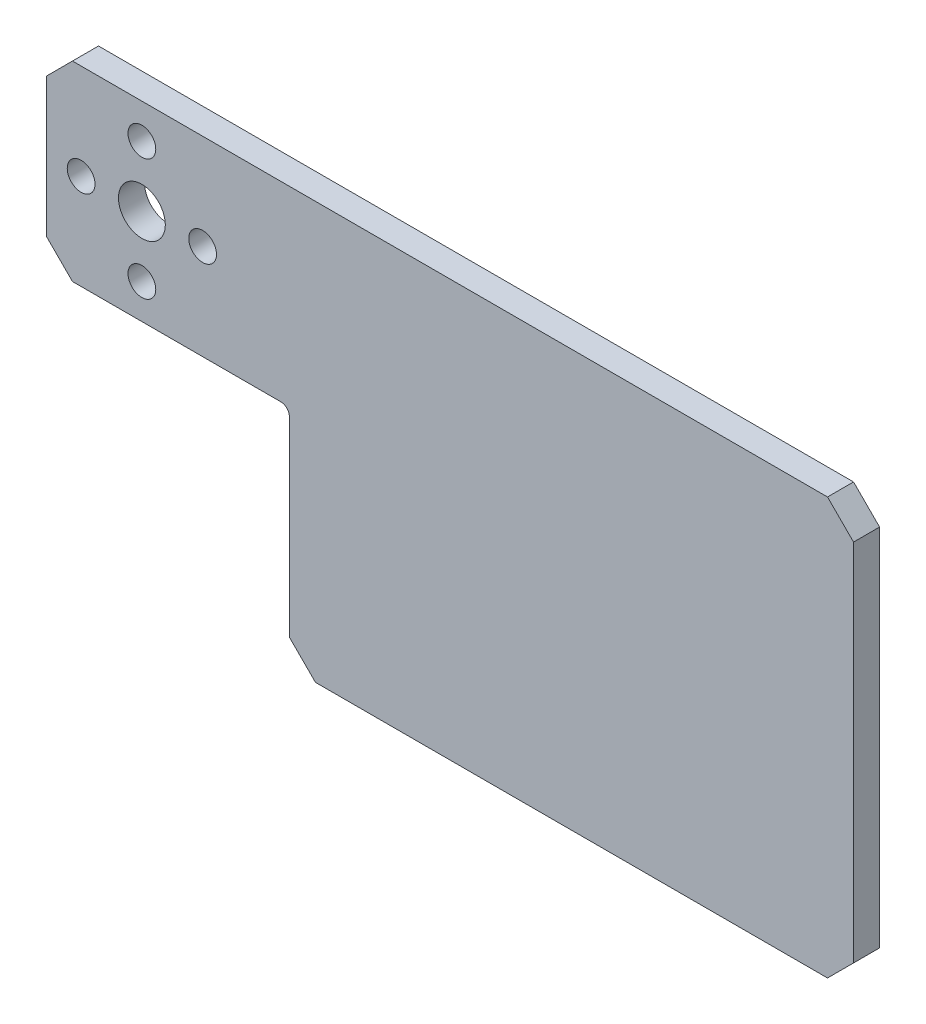
ISO-10303-21;
HEADER;
FILE_DESCRIPTION(('STEP AP214'),'2;1');
FILE_NAME('part.step','',(''),(''),'','','');
FILE_SCHEMA(('AUTOMOTIVE_DESIGN { 1 0 10303 214 1 1 1 1 }'));
ENDSEC;
DATA;
#1=APPLICATION_CONTEXT('core data for automotive mechanical design processes');
#2=APPLICATION_PROTOCOL_DEFINITION('international standard','automotive_design',2000,#1);
#3=PRODUCT_CONTEXT('',#1,'mechanical');
#4=PRODUCT('Part','Part','',(#3));
#5=PRODUCT_RELATED_PRODUCT_CATEGORY('part','',(#4));
#6=PRODUCT_DEFINITION_FORMATION('','',#4);
#7=PRODUCT_DEFINITION_CONTEXT('part definition',#1,'design');
#8=PRODUCT_DEFINITION('design','',#6,#7);
#9=PRODUCT_DEFINITION_SHAPE('','',#8);
#10=(LENGTH_UNIT() NAMED_UNIT(*) SI_UNIT(.MILLI.,.METRE.));
#11=(NAMED_UNIT(*) PLANE_ANGLE_UNIT() SI_UNIT($,.RADIAN.));
#12=(NAMED_UNIT(*) SI_UNIT($,.STERADIAN.) SOLID_ANGLE_UNIT());
#13=UNCERTAINTY_MEASURE_WITH_UNIT(LENGTH_MEASURE(1.E-05),#10,'distance_accuracy_value','');
#14=(GEOMETRIC_REPRESENTATION_CONTEXT(3) GLOBAL_UNCERTAINTY_ASSIGNED_CONTEXT((#13)) GLOBAL_UNIT_ASSIGNED_CONTEXT((#10,
#11,#12)) REPRESENTATION_CONTEXT('',''));
#15=CARTESIAN_POINT('',(0.,0.,0.));
#16=DIRECTION('',(0.,0.,1.));
#17=DIRECTION('',(1.,0.,0.));
#18=AXIS2_PLACEMENT_3D('',#15,#16,#17);
#19=CARTESIAN_POINT('',(-46.5,-24.,3.));
#20=DIRECTION('',(1.,0.,0.));
#21=DIRECTION('',(0.,0.,-1.));
#22=AXIS2_PLACEMENT_3D('',#19,#20,#21);
#23=PLANE('',#22);
#24=DIRECTION('',(0.,-1.,0.));
#25=VECTOR('',#24,1.);
#26=CARTESIAN_POINT('',(-46.5,-24.,3.));
#27=LINE('',#26,#25);
#28=CARTESIAN_POINT('',(-46.5,21.,3.));
#29=VERTEX_POINT('',#28);
#30=CARTESIAN_POINT('',(-46.5,5.,3.));
#31=VERTEX_POINT('',#30);
#32=EDGE_CURVE('E193',#29,#31,#27,.T.);
#33=ORIENTED_EDGE('',*,*,#32,.F.);
#34=DIRECTION('',(0.,0.,-1.));
#35=VECTOR('',#34,1.);
#36=CARTESIAN_POINT('',(-46.5,21.,3.));
#37=LINE('',#36,#35);
#38=CARTESIAN_POINT('',(-46.5,21.,0.));
#39=VERTEX_POINT('',#38);
#40=EDGE_CURVE('E46',#29,#39,#37,.T.);
#41=ORIENTED_EDGE('',*,*,#40,.T.);
#42=DIRECTION('',(0.,-1.,0.));
#43=VECTOR('',#42,1.);
#44=CARTESIAN_POINT('',(-46.5,-24.,0.));
#45=LINE('',#44,#43);
#46=CARTESIAN_POINT('',(-46.5,5.,0.));
#47=VERTEX_POINT('',#46);
#48=EDGE_CURVE('E184',#39,#47,#45,.T.);
#49=ORIENTED_EDGE('',*,*,#48,.T.);
#50=DIRECTION('',(0.,0.,1.));
#51=VECTOR('',#50,1.);
#52=CARTESIAN_POINT('',(-46.5,5.,3.));
#53=LINE('',#52,#51);
#54=EDGE_CURVE('E248',#47,#31,#53,.T.);
#55=ORIENTED_EDGE('',*,*,#54,.T.);
#56=EDGE_LOOP('',(#33,#41,#49,#55));
#57=FACE_BOUND('',#56,.T.);
#58=ADVANCED_FACE('F37',(#57),#23,.F.);
#59=CARTESIAN_POINT('',(46.5,-24.,3.));
#60=DIRECTION('',(0.,1.,0.));
#61=DIRECTION('',(-1.,0.,0.));
#62=AXIS2_PLACEMENT_3D('',#59,#60,#61);
#63=PLANE('',#62);
#64=DIRECTION('',(1.,0.,0.));
#65=VECTOR('',#64,1.);
#66=CARTESIAN_POINT('',(46.5,-24.,3.));
#67=LINE('',#66,#65);
#68=CARTESIAN_POINT('',(-15.5,-24.,3.));
#69=VERTEX_POINT('',#68);
#70=CARTESIAN_POINT('',(43.5,-24.,3.));
#71=VERTEX_POINT('',#70);
#72=EDGE_CURVE('E195',#69,#71,#67,.T.);
#73=ORIENTED_EDGE('',*,*,#72,.F.);
#74=DIRECTION('',(0.,0.,-1.));
#75=VECTOR('',#74,1.);
#76=CARTESIAN_POINT('',(-15.5,-24.,3.));
#77=LINE('',#76,#75);
#78=CARTESIAN_POINT('',(-15.5,-24.,0.));
#79=VERTEX_POINT('',#78);
#80=EDGE_CURVE('E229',#69,#79,#77,.T.);
#81=ORIENTED_EDGE('',*,*,#80,.T.);
#82=DIRECTION('',(1.,0.,0.));
#83=VECTOR('',#82,1.);
#84=CARTESIAN_POINT('',(46.5,-24.,0.));
#85=LINE('',#84,#83);
#86=CARTESIAN_POINT('',(43.5,-24.,0.));
#87=VERTEX_POINT('',#86);
#88=EDGE_CURVE('E206',#79,#87,#85,.T.);
#89=ORIENTED_EDGE('',*,*,#88,.T.);
#90=DIRECTION('',(0.,0.,1.));
#91=VECTOR('',#90,1.);
#92=CARTESIAN_POINT('',(43.5,-24.,3.));
#93=LINE('',#92,#91);
#94=EDGE_CURVE('E227',#87,#71,#93,.T.);
#95=ORIENTED_EDGE('',*,*,#94,.T.);
#96=EDGE_LOOP('',(#73,#81,#89,#95));
#97=FACE_BOUND('',#96,.T.);
#98=ADVANCED_FACE('F280',(#97),#63,.F.);
#99=CARTESIAN_POINT('',(46.5,-24.,3.));
#100=DIRECTION('',(-1.,0.,0.));
#101=DIRECTION('',(0.,0.,1.));
#102=AXIS2_PLACEMENT_3D('',#99,#100,#101);
#103=PLANE('',#102);
#104=DIRECTION('',(0.,1.,0.));
#105=VECTOR('',#104,1.);
#106=CARTESIAN_POINT('',(46.5,-24.,3.));
#107=LINE('',#106,#105);
#108=CARTESIAN_POINT('',(46.5,-21.,3.));
#109=VERTEX_POINT('',#108);
#110=CARTESIAN_POINT('',(46.5,21.,3.));
#111=VERTEX_POINT('',#110);
#112=EDGE_CURVE('E199',#109,#111,#107,.T.);
#113=ORIENTED_EDGE('',*,*,#112,.F.);
#114=DIRECTION('',(0.,0.,-1.));
#115=VECTOR('',#114,1.);
#116=CARTESIAN_POINT('',(46.5,-21.,3.));
#117=LINE('',#116,#115);
#118=CARTESIAN_POINT('',(46.5,-21.,0.));
#119=VERTEX_POINT('',#118);
#120=EDGE_CURVE('E241',#109,#119,#117,.T.);
#121=ORIENTED_EDGE('',*,*,#120,.T.);
#122=DIRECTION('',(0.,1.,0.));
#123=VECTOR('',#122,1.);
#124=CARTESIAN_POINT('',(46.5,-24.,0.));
#125=LINE('',#124,#123);
#126=CARTESIAN_POINT('',(46.5,21.,0.));
#127=VERTEX_POINT('',#126);
#128=EDGE_CURVE('E209',#119,#127,#125,.T.);
#129=ORIENTED_EDGE('',*,*,#128,.T.);
#130=DIRECTION('',(0.,0.,1.));
#131=VECTOR('',#130,1.);
#132=CARTESIAN_POINT('',(46.5,21.,3.));
#133=LINE('',#132,#131);
#134=EDGE_CURVE('E239',#127,#111,#133,.T.);
#135=ORIENTED_EDGE('',*,*,#134,.T.);
#136=EDGE_LOOP('',(#113,#121,#129,#135));
#137=FACE_BOUND('',#136,.T.);
#138=ADVANCED_FACE('F274',(#137),#103,.F.);
#139=CARTESIAN_POINT('',(46.5,24.,3.));
#140=DIRECTION('',(0.,-1.,0.));
#141=DIRECTION('',(1.,0.,0.));
#142=AXIS2_PLACEMENT_3D('',#139,#140,#141);
#143=PLANE('',#142);
#144=DIRECTION('',(-1.,0.,0.));
#145=VECTOR('',#144,1.);
#146=CARTESIAN_POINT('',(46.5,24.,3.));
#147=LINE('',#146,#145);
#148=CARTESIAN_POINT('',(43.5,24.,3.));
#149=VERTEX_POINT('',#148);
#150=CARTESIAN_POINT('',(-43.5,24.,3.));
#151=VERTEX_POINT('',#150);
#152=EDGE_CURVE('E149',#149,#151,#147,.T.);
#153=ORIENTED_EDGE('',*,*,#152,.F.);
#154=DIRECTION('',(0.,0.,-1.));
#155=VECTOR('',#154,1.);
#156=CARTESIAN_POINT('',(43.5,24.,3.));
#157=LINE('',#156,#155);
#158=CARTESIAN_POINT('',(43.5,24.,0.));
#159=VERTEX_POINT('',#158);
#160=EDGE_CURVE('E245',#149,#159,#157,.T.);
#161=ORIENTED_EDGE('',*,*,#160,.T.);
#162=DIRECTION('',(-1.,0.,0.));
#163=VECTOR('',#162,1.);
#164=CARTESIAN_POINT('',(46.5,24.,0.));
#165=LINE('',#164,#163);
#166=CARTESIAN_POINT('',(-43.5,24.,0.));
#167=VERTEX_POINT('',#166);
#168=EDGE_CURVE('E196',#159,#167,#165,.T.);
#169=ORIENTED_EDGE('',*,*,#168,.T.);
#170=DIRECTION('',(0.,0.,1.));
#171=VECTOR('',#170,1.);
#172=CARTESIAN_POINT('',(-43.5,24.,3.));
#173=LINE('',#172,#171);
#174=EDGE_CURVE('E243',#167,#151,#173,.T.);
#175=ORIENTED_EDGE('',*,*,#174,.T.);
#176=EDGE_LOOP('',(#153,#161,#169,#175));
#177=FACE_BOUND('',#176,.T.);
#178=ADVANCED_FACE('F266',(#177),#143,.F.);
#179=CARTESIAN_POINT('',(0.,0.,3.));
#180=DIRECTION('',(0.,0.,1.));
#181=DIRECTION('',(1.,0.,0.));
#182=AXIS2_PLACEMENT_3D('',#179,#180,#181);
#183=PLANE('',#182);
#184=DIRECTION('',(0.,1.,0.));
#185=VECTOR('',#184,1.);
#186=CARTESIAN_POINT('',(-18.5,-24.,3.));
#187=LINE('',#186,#185);
#188=CARTESIAN_POINT('',(-18.5,-21.,3.));
#189=VERTEX_POINT('',#188);
#190=CARTESIAN_POINT('',(-18.5,1.,3.));
#191=VERTEX_POINT('',#190);
#192=EDGE_CURVE('E156',#189,#191,#187,.T.);
#193=ORIENTED_EDGE('',*,*,#192,.F.);
#194=DIRECTION('',(-0.707106781186549,0.707106781186546,0.));
#195=VECTOR('',#194,1.);
#196=CARTESIAN_POINT('',(-19.75,-19.7500000000001,3.));
#197=LINE('',#196,#195);
#198=EDGE_CURVE('E225',#189,#69,#197,.F.);
#199=ORIENTED_EDGE('',*,*,#198,.T.);
#200=ORIENTED_EDGE('',*,*,#72,.T.);
#201=DIRECTION('',(-0.707106781186549,-0.707106781186546,0.));
#202=VECTOR('',#201,1.);
#203=CARTESIAN_POINT('',(33.7499999999999,-33.75,3.));
#204=LINE('',#203,#202);
#205=EDGE_CURVE('E223',#71,#109,#204,.F.);
#206=ORIENTED_EDGE('',*,*,#205,.T.);
#207=ORIENTED_EDGE('',*,*,#112,.T.);
#208=DIRECTION('',(0.707106781186544,-0.707106781186551,0.));
#209=VECTOR('',#208,1.);
#210=CARTESIAN_POINT('',(33.7500000000002,33.7499999999999,3.));
#211=LINE('',#210,#209);
#212=EDGE_CURVE('E221',#111,#149,#211,.F.);
#213=ORIENTED_EDGE('',*,*,#212,.T.);
#214=ORIENTED_EDGE('',*,*,#152,.T.);
#215=DIRECTION('',(0.70710678118655,0.707106781186545,0.));
#216=VECTOR('',#215,1.);
#217=CARTESIAN_POINT('',(-33.7499999999999,33.7500000000001,3.));
#218=LINE('',#217,#216);
#219=EDGE_CURVE('E219',#151,#29,#218,.F.);
#220=ORIENTED_EDGE('',*,*,#219,.T.);
#221=ORIENTED_EDGE('',*,*,#32,.T.);
#222=DIRECTION('',(-0.707106781186549,0.707106781186546,0.));
#223=VECTOR('',#222,1.);
#224=CARTESIAN_POINT('',(-20.7499999999999,-20.75,3.));
#225=LINE('',#224,#223);
#226=CARTESIAN_POINT('',(-43.5,2.,3.));
#227=VERTEX_POINT('',#226);
#228=EDGE_CURVE('E154',#31,#227,#225,.F.);
#229=ORIENTED_EDGE('',*,*,#228,.T.);
#230=DIRECTION('',(-1.,0.,0.));
#231=VECTOR('',#230,1.);
#232=CARTESIAN_POINT('',(-46.5,2.,3.));
#233=LINE('',#232,#231);
#234=CARTESIAN_POINT('',(-19.5,2.,3.));
#235=VERTEX_POINT('',#234);
#236=EDGE_CURVE('E145',#235,#227,#233,.T.);
#237=ORIENTED_EDGE('',*,*,#236,.F.);
#238=CARTESIAN_POINT('',(-19.5,1.,3.));
#239=DIRECTION('',(0.,0.,1.));
#240=DIRECTION('',(1.,0.,0.));
#241=AXIS2_PLACEMENT_3D('',#238,#239,#240);
#242=CIRCLE('',#241,1.);
#243=EDGE_CURVE('E129',#235,#191,#242,.F.);
#244=ORIENTED_EDGE('',*,*,#243,.T.);
#245=EDGE_LOOP('',(#193,#199,#200,#206,#207,#213,#214,#220,#221,#229,#237,#244));
#246=FACE_BOUND('',#245,.T.);
#247=CARTESIAN_POINT('',(-35.4999999999999,6.,3.));
#248=DIRECTION('',(0.,0.,1.));
#249=DIRECTION('',(0.,-1.,0.));
#250=AXIS2_PLACEMENT_3D('',#247,#248,#249);
#251=CIRCLE('',#250,1.6);
#252=CARTESIAN_POINT('',(-35.4999999999999,4.4,3.));
#253=VERTEX_POINT('',#252);
#254=EDGE_CURVE('E178',#253,#253,#251,.T.);
#255=ORIENTED_EDGE('',*,*,#254,.F.);
#256=EDGE_LOOP('',(#255));
#257=FACE_BOUND('',#256,.T.);
#258=CARTESIAN_POINT('',(-35.5,20.,3.));
#259=DIRECTION('',(0.,0.,1.));
#260=DIRECTION('',(0.,1.,0.));
#261=AXIS2_PLACEMENT_3D('',#258,#259,#260);
#262=CIRCLE('',#261,1.6);
#263=CARTESIAN_POINT('',(-35.5,21.6,3.));
#264=VERTEX_POINT('',#263);
#265=EDGE_CURVE('E165',#264,#264,#262,.T.);
#266=ORIENTED_EDGE('',*,*,#265,.F.);
#267=EDGE_LOOP('',(#266));
#268=FACE_BOUND('',#267,.T.);
#269=CARTESIAN_POINT('',(-42.5,13.,3.));
#270=DIRECTION('',(0.,0.,1.));
#271=DIRECTION('',(-1.,0.,0.));
#272=AXIS2_PLACEMENT_3D('',#269,#270,#271);
#273=CIRCLE('',#272,1.6);
#274=CARTESIAN_POINT('',(-44.1,13.,3.));
#275=VERTEX_POINT('',#274);
#276=EDGE_CURVE('E166',#275,#275,#273,.T.);
#277=ORIENTED_EDGE('',*,*,#276,.F.);
#278=EDGE_LOOP('',(#277));
#279=FACE_BOUND('',#278,.T.);
#280=CARTESIAN_POINT('',(-35.5,13.,3.));
#281=DIRECTION('',(0.,0.,1.));
#282=DIRECTION('',(1.,0.,0.));
#283=AXIS2_PLACEMENT_3D('',#280,#281,#282);
#284=CIRCLE('',#283,2.7);
#285=CARTESIAN_POINT('',(-32.8,13.,3.));
#286=VERTEX_POINT('',#285);
#287=EDGE_CURVE('E185',#286,#286,#284,.T.);
#288=ORIENTED_EDGE('',*,*,#287,.F.);
#289=EDGE_LOOP('',(#288));
#290=FACE_BOUND('',#289,.T.);
#291=CARTESIAN_POINT('',(-28.5,13.,3.));
#292=DIRECTION('',(0.,0.,1.));
#293=DIRECTION('',(1.,0.,0.));
#294=AXIS2_PLACEMENT_3D('',#291,#292,#293);
#295=CIRCLE('',#294,1.6);
#296=CARTESIAN_POINT('',(-26.9,13.,3.));
#297=VERTEX_POINT('',#296);
#298=EDGE_CURVE('E173',#297,#297,#295,.T.);
#299=ORIENTED_EDGE('',*,*,#298,.F.);
#300=EDGE_LOOP('',(#299));
#301=FACE_BOUND('',#300,.T.);
#302=ADVANCED_FACE('F151',(#246,#257,#268,#279,#290,#301),#183,.T.);
#303=CARTESIAN_POINT('',(0.,0.,0.));
#304=DIRECTION('',(0.,0.,1.));
#305=DIRECTION('',(1.,0.,0.));
#306=AXIS2_PLACEMENT_3D('',#303,#304,#305);
#307=PLANE('',#306);
#308=CARTESIAN_POINT('',(-35.4999999999999,6.,0.));
#309=DIRECTION('',(0.,0.,1.));
#310=DIRECTION('',(0.,-1.,0.));
#311=AXIS2_PLACEMENT_3D('',#308,#309,#310);
#312=CIRCLE('',#311,1.6);
#313=CARTESIAN_POINT('',(-35.4999999999999,4.4,0.));
#314=VERTEX_POINT('',#313);
#315=EDGE_CURVE('E169',#314,#314,#312,.T.);
#316=ORIENTED_EDGE('',*,*,#315,.T.);
#317=EDGE_LOOP('',(#316));
#318=FACE_BOUND('',#317,.T.);
#319=CARTESIAN_POINT('',(-35.5,20.,0.));
#320=DIRECTION('',(0.,0.,1.));
#321=DIRECTION('',(0.,1.,0.));
#322=AXIS2_PLACEMENT_3D('',#319,#320,#321);
#323=CIRCLE('',#322,1.6);
#324=CARTESIAN_POINT('',(-35.5,21.6,0.));
#325=VERTEX_POINT('',#324);
#326=EDGE_CURVE('E170',#325,#325,#323,.T.);
#327=ORIENTED_EDGE('',*,*,#326,.T.);
#328=EDGE_LOOP('',(#327));
#329=FACE_BOUND('',#328,.T.);
#330=CARTESIAN_POINT('',(-42.5,13.,0.));
#331=DIRECTION('',(0.,0.,1.));
#332=DIRECTION('',(-1.,0.,0.));
#333=AXIS2_PLACEMENT_3D('',#330,#331,#332);
#334=CIRCLE('',#333,1.6);
#335=CARTESIAN_POINT('',(-44.1,13.,0.));
#336=VERTEX_POINT('',#335);
#337=EDGE_CURVE('E162',#336,#336,#334,.T.);
#338=ORIENTED_EDGE('',*,*,#337,.T.);
#339=EDGE_LOOP('',(#338));
#340=FACE_BOUND('',#339,.T.);
#341=CARTESIAN_POINT('',(-35.5,13.,0.));
#342=DIRECTION('',(0.,0.,1.));
#343=DIRECTION('',(1.,0.,0.));
#344=AXIS2_PLACEMENT_3D('',#341,#342,#343);
#345=CIRCLE('',#344,2.7);
#346=CARTESIAN_POINT('',(-32.8,13.,0.));
#347=VERTEX_POINT('',#346);
#348=EDGE_CURVE('E181',#347,#347,#345,.T.);
#349=ORIENTED_EDGE('',*,*,#348,.T.);
#350=EDGE_LOOP('',(#349));
#351=FACE_BOUND('',#350,.T.);
#352=CARTESIAN_POINT('',(-28.5,13.,0.));
#353=DIRECTION('',(0.,0.,1.));
#354=DIRECTION('',(1.,0.,0.));
#355=AXIS2_PLACEMENT_3D('',#352,#353,#354);
#356=CIRCLE('',#355,1.6);
#357=CARTESIAN_POINT('',(-26.9,13.,0.));
#358=VERTEX_POINT('',#357);
#359=EDGE_CURVE('E188',#358,#358,#356,.T.);
#360=ORIENTED_EDGE('',*,*,#359,.T.);
#361=EDGE_LOOP('',(#360));
#362=FACE_BOUND('',#361,.T.);
#363=ORIENTED_EDGE('',*,*,#88,.F.);
#364=DIRECTION('',(0.707106781186549,-0.707106781186546,0.));
#365=VECTOR('',#364,1.);
#366=CARTESIAN_POINT('',(-18.5,-21.,0.));
#367=LINE('',#366,#365);
#368=CARTESIAN_POINT('',(-18.5,-21.,0.));
#369=VERTEX_POINT('',#368);
#370=EDGE_CURVE('E237',#79,#369,#367,.F.);
#371=ORIENTED_EDGE('',*,*,#370,.T.);
#372=DIRECTION('',(0.,1.,0.));
#373=VECTOR('',#372,1.);
#374=CARTESIAN_POINT('',(-18.5,-24.,0.));
#375=LINE('',#374,#373);
#376=CARTESIAN_POINT('',(-18.5,1.,0.));
#377=VERTEX_POINT('',#376);
#378=EDGE_CURVE('E155',#369,#377,#375,.T.);
#379=ORIENTED_EDGE('',*,*,#378,.T.);
#380=CARTESIAN_POINT('',(-19.5,1.,0.));
#381=DIRECTION('',(0.,0.,1.));
#382=DIRECTION('',(1.,0.,0.));
#383=AXIS2_PLACEMENT_3D('',#380,#381,#382);
#384=CIRCLE('',#383,1.);
#385=CARTESIAN_POINT('',(-19.5,2.,0.));
#386=VERTEX_POINT('',#385);
#387=EDGE_CURVE('E139',#377,#386,#384,.T.);
#388=ORIENTED_EDGE('',*,*,#387,.T.);
#389=DIRECTION('',(-1.,0.,0.));
#390=VECTOR('',#389,1.);
#391=CARTESIAN_POINT('',(-46.5,2.,0.));
#392=LINE('',#391,#390);
#393=CARTESIAN_POINT('',(-43.5,2.,0.));
#394=VERTEX_POINT('',#393);
#395=EDGE_CURVE('E148',#386,#394,#392,.T.);
#396=ORIENTED_EDGE('',*,*,#395,.T.);
#397=DIRECTION('',(0.707106781186549,-0.707106781186546,0.));
#398=VECTOR('',#397,1.);
#399=CARTESIAN_POINT('',(-46.5,5.,0.));
#400=LINE('',#399,#398);
#401=EDGE_CURVE('E231',#394,#47,#400,.F.);
#402=ORIENTED_EDGE('',*,*,#401,.T.);
#403=ORIENTED_EDGE('',*,*,#48,.F.);
#404=DIRECTION('',(-0.70710678118655,-0.707106781186545,0.));
#405=VECTOR('',#404,1.);
#406=CARTESIAN_POINT('',(-46.5,21.,0.));
#407=LINE('',#406,#405);
#408=EDGE_CURVE('E233',#39,#167,#407,.F.);
#409=ORIENTED_EDGE('',*,*,#408,.T.);
#410=ORIENTED_EDGE('',*,*,#168,.F.);
#411=DIRECTION('',(-0.707106781186544,0.707106781186551,0.));
#412=VECTOR('',#411,1.);
#413=CARTESIAN_POINT('',(43.5,24.,0.));
#414=LINE('',#413,#412);
#415=EDGE_CURVE('E53',#159,#127,#414,.F.);
#416=ORIENTED_EDGE('',*,*,#415,.T.);
#417=ORIENTED_EDGE('',*,*,#128,.F.);
#418=DIRECTION('',(0.707106781186549,0.707106781186546,0.));
#419=VECTOR('',#418,1.);
#420=CARTESIAN_POINT('',(46.5,-21.,0.));
#421=LINE('',#420,#419);
#422=EDGE_CURVE('E61',#119,#87,#421,.F.);
#423=ORIENTED_EDGE('',*,*,#422,.T.);
#424=EDGE_LOOP('',(#363,#371,#379,#388,#396,#402,#403,#409,#410,#416,#417,#423));
#425=FACE_BOUND('',#424,.T.);
#426=ADVANCED_FACE('F259',(#318,#329,#340,#351,#362,#425),#307,.F.);
#427=CARTESIAN_POINT('',(-28.5,13.,0.));
#428=DIRECTION('',(0.,0.,1.));
#429=DIRECTION('',(1.,0.,0.));
#430=AXIS2_PLACEMENT_3D('',#427,#428,#429);
#431=CYLINDRICAL_SURFACE('',#430,1.6);
#432=ORIENTED_EDGE('',*,*,#359,.F.);
#433=EDGE_LOOP('',(#432));
#434=FACE_BOUND('',#433,.T.);
#435=ORIENTED_EDGE('',*,*,#298,.T.);
#436=EDGE_LOOP('',(#435));
#437=FACE_BOUND('',#436,.T.);
#438=ADVANCED_FACE('F373',(#434,#437),#431,.F.);
#439=CARTESIAN_POINT('',(-35.5,13.,0.));
#440=DIRECTION('',(0.,0.,1.));
#441=DIRECTION('',(1.,0.,0.));
#442=AXIS2_PLACEMENT_3D('',#439,#440,#441);
#443=CYLINDRICAL_SURFACE('',#442,2.7);
#444=ORIENTED_EDGE('',*,*,#348,.F.);
#445=EDGE_LOOP('',(#444));
#446=FACE_BOUND('',#445,.T.);
#447=ORIENTED_EDGE('',*,*,#287,.T.);
#448=EDGE_LOOP('',(#447));
#449=FACE_BOUND('',#448,.T.);
#450=ADVANCED_FACE('F441',(#446,#449),#443,.F.);
#451=CARTESIAN_POINT('',(-42.5,13.,0.));
#452=DIRECTION('',(0.,0.,1.));
#453=DIRECTION('',(1.,0.,0.));
#454=AXIS2_PLACEMENT_3D('',#451,#452,#453);
#455=CYLINDRICAL_SURFACE('',#454,1.6);
#456=ORIENTED_EDGE('',*,*,#337,.F.);
#457=EDGE_LOOP('',(#456));
#458=FACE_BOUND('',#457,.T.);
#459=ORIENTED_EDGE('',*,*,#276,.T.);
#460=EDGE_LOOP('',(#459));
#461=FACE_BOUND('',#460,.T.);
#462=ADVANCED_FACE('F431',(#458,#461),#455,.F.);
#463=CARTESIAN_POINT('',(-35.5,20.,0.));
#464=DIRECTION('',(0.,0.,1.));
#465=DIRECTION('',(1.,0.,0.));
#466=AXIS2_PLACEMENT_3D('',#463,#464,#465);
#467=CYLINDRICAL_SURFACE('',#466,1.6);
#468=ORIENTED_EDGE('',*,*,#326,.F.);
#469=EDGE_LOOP('',(#468));
#470=FACE_BOUND('',#469,.T.);
#471=ORIENTED_EDGE('',*,*,#265,.T.);
#472=EDGE_LOOP('',(#471));
#473=FACE_BOUND('',#472,.T.);
#474=ADVANCED_FACE('F421',(#470,#473),#467,.F.);
#475=CARTESIAN_POINT('',(-35.4999999999999,6.,0.));
#476=DIRECTION('',(0.,0.,1.));
#477=DIRECTION('',(1.,0.,0.));
#478=AXIS2_PLACEMENT_3D('',#475,#476,#477);
#479=CYLINDRICAL_SURFACE('',#478,1.6);
#480=ORIENTED_EDGE('',*,*,#315,.F.);
#481=EDGE_LOOP('',(#480));
#482=FACE_BOUND('',#481,.T.);
#483=ORIENTED_EDGE('',*,*,#254,.T.);
#484=EDGE_LOOP('',(#483));
#485=FACE_BOUND('',#484,.T.);
#486=ADVANCED_FACE('F295',(#482,#485),#479,.F.);
#487=CARTESIAN_POINT('',(-46.5,2.,0.));
#488=DIRECTION('',(0.,1.,0.));
#489=DIRECTION('',(0.,0.,1.));
#490=AXIS2_PLACEMENT_3D('',#487,#488,#489);
#491=PLANE('',#490);
#492=ORIENTED_EDGE('',*,*,#236,.T.);
#493=DIRECTION('',(0.,0.,-1.));
#494=VECTOR('',#493,1.);
#495=CARTESIAN_POINT('',(-43.5,2.,0.));
#496=LINE('',#495,#494);
#497=EDGE_CURVE('E11',#227,#394,#496,.T.);
#498=ORIENTED_EDGE('',*,*,#497,.T.);
#499=ORIENTED_EDGE('',*,*,#395,.F.);
#500=DIRECTION('',(0.,0.,1.));
#501=VECTOR('',#500,1.);
#502=CARTESIAN_POINT('',(-19.5,2.,3.));
#503=LINE('',#502,#501);
#504=EDGE_CURVE('E133',#386,#235,#503,.T.);
#505=ORIENTED_EDGE('',*,*,#504,.T.);
#506=EDGE_LOOP('',(#492,#498,#499,#505));
#507=FACE_BOUND('',#506,.T.);
#508=ADVANCED_FACE('F144',(#507),#491,.F.);
#509=CARTESIAN_POINT('',(-18.5,-24.,0.));
#510=DIRECTION('',(1.,0.,0.));
#511=DIRECTION('',(0.,0.,-1.));
#512=AXIS2_PLACEMENT_3D('',#509,#510,#511);
#513=PLANE('',#512);
#514=ORIENTED_EDGE('',*,*,#378,.F.);
#515=DIRECTION('',(0.,0.,1.));
#516=VECTOR('',#515,1.);
#517=CARTESIAN_POINT('',(-18.5,-21.,0.));
#518=LINE('',#517,#516);
#519=EDGE_CURVE('E215',#369,#189,#518,.T.);
#520=ORIENTED_EDGE('',*,*,#519,.T.);
#521=ORIENTED_EDGE('',*,*,#192,.T.);
#522=DIRECTION('',(0.,0.,1.));
#523=VECTOR('',#522,1.);
#524=CARTESIAN_POINT('',(-18.5,1.,0.));
#525=LINE('',#524,#523);
#526=EDGE_CURVE('E135',#191,#377,#525,.F.);
#527=ORIENTED_EDGE('',*,*,#526,.T.);
#528=EDGE_LOOP('',(#514,#520,#521,#527));
#529=FACE_BOUND('',#528,.T.);
#530=ADVANCED_FACE('F287',(#529),#513,.F.);
#531=CARTESIAN_POINT('',(-19.5,1.,0.));
#532=DIRECTION('',(0.,0.,-1.));
#533=DIRECTION('',(-1.,0.,0.));
#534=AXIS2_PLACEMENT_3D('',#531,#532,#533);
#535=CYLINDRICAL_SURFACE('',#534,1.);
#536=ORIENTED_EDGE('',*,*,#387,.F.);
#537=ORIENTED_EDGE('',*,*,#526,.F.);
#538=ORIENTED_EDGE('',*,*,#243,.F.);
#539=ORIENTED_EDGE('',*,*,#504,.F.);
#540=EDGE_LOOP('',(#536,#537,#538,#539));
#541=FACE_BOUND('',#540,.T.);
#542=ADVANCED_FACE('F132',(#541),#535,.F.);
#543=CARTESIAN_POINT('',(-18.5,-21.,0.));
#544=DIRECTION('',(0.707106781186546,0.707106781186549,0.));
#545=DIRECTION('',(0.,0.,1.));
#546=AXIS2_PLACEMENT_3D('',#543,#544,#545);
#547=PLANE('',#546);
#548=ORIENTED_EDGE('',*,*,#370,.F.);
#549=ORIENTED_EDGE('',*,*,#80,.F.);
#550=ORIENTED_EDGE('',*,*,#198,.F.);
#551=ORIENTED_EDGE('',*,*,#519,.F.);
#552=EDGE_LOOP('',(#548,#549,#550,#551));
#553=FACE_BOUND('',#552,.T.);
#554=ADVANCED_FACE('F283',(#553),#547,.F.);
#555=CARTESIAN_POINT('',(46.5,-21.,3.));
#556=DIRECTION('',(-0.707106781186546,0.707106781186549,0.));
#557=DIRECTION('',(0.,0.,-1.));
#558=AXIS2_PLACEMENT_3D('',#555,#556,#557);
#559=PLANE('',#558);
#560=ORIENTED_EDGE('',*,*,#205,.F.);
#561=ORIENTED_EDGE('',*,*,#94,.F.);
#562=ORIENTED_EDGE('',*,*,#422,.F.);
#563=ORIENTED_EDGE('',*,*,#120,.F.);
#564=EDGE_LOOP('',(#560,#561,#562,#563));
#565=FACE_BOUND('',#564,.T.);
#566=ADVANCED_FACE('F277',(#565),#559,.F.);
#567=CARTESIAN_POINT('',(43.5,24.,3.));
#568=DIRECTION('',(-0.707106781186551,-0.707106781186544,0.));
#569=DIRECTION('',(0.,0.,-1.));
#570=AXIS2_PLACEMENT_3D('',#567,#568,#569);
#571=PLANE('',#570);
#572=ORIENTED_EDGE('',*,*,#212,.F.);
#573=ORIENTED_EDGE('',*,*,#134,.F.);
#574=ORIENTED_EDGE('',*,*,#415,.F.);
#575=ORIENTED_EDGE('',*,*,#160,.F.);
#576=EDGE_LOOP('',(#572,#573,#574,#575));
#577=FACE_BOUND('',#576,.T.);
#578=ADVANCED_FACE('F270',(#577),#571,.F.);
#579=CARTESIAN_POINT('',(-46.5,21.,3.));
#580=DIRECTION('',(0.707106781186545,-0.70710678118655,0.));
#581=DIRECTION('',(0.,0.,-1.));
#582=AXIS2_PLACEMENT_3D('',#579,#580,#581);
#583=PLANE('',#582);
#584=ORIENTED_EDGE('',*,*,#219,.F.);
#585=ORIENTED_EDGE('',*,*,#174,.F.);
#586=ORIENTED_EDGE('',*,*,#408,.F.);
#587=ORIENTED_EDGE('',*,*,#40,.F.);
#588=EDGE_LOOP('',(#584,#585,#586,#587));
#589=FACE_BOUND('',#588,.T.);
#590=ADVANCED_FACE('F264',(#589),#583,.F.);
#591=CARTESIAN_POINT('',(-46.5,5.,3.));
#592=DIRECTION('',(0.707106781186546,0.707106781186549,0.));
#593=DIRECTION('',(0.,0.,1.));
#594=AXIS2_PLACEMENT_3D('',#591,#592,#593);
#595=PLANE('',#594);
#596=ORIENTED_EDGE('',*,*,#401,.F.);
#597=ORIENTED_EDGE('',*,*,#497,.F.);
#598=ORIENTED_EDGE('',*,*,#228,.F.);
#599=ORIENTED_EDGE('',*,*,#54,.F.);
#600=EDGE_LOOP('',(#596,#597,#598,#599));
#601=FACE_BOUND('',#600,.T.);
#602=ADVANCED_FACE('F40',(#601),#595,.F.);
#603=CLOSED_SHELL('',(#58,#98,#138,#178,#302,#426,#438,#450,#462,#474,#486,#508,#530,#542,#554,
#566,#578,#590,#602));
#604=MANIFOLD_SOLID_BREP('B2',#603);
#605=ADVANCED_BREP_SHAPE_REPRESENTATION('',(#18,#604),#14);
#606=SHAPE_DEFINITION_REPRESENTATION(#9,#605);
ENDSEC;
END-ISO-10303-21;
